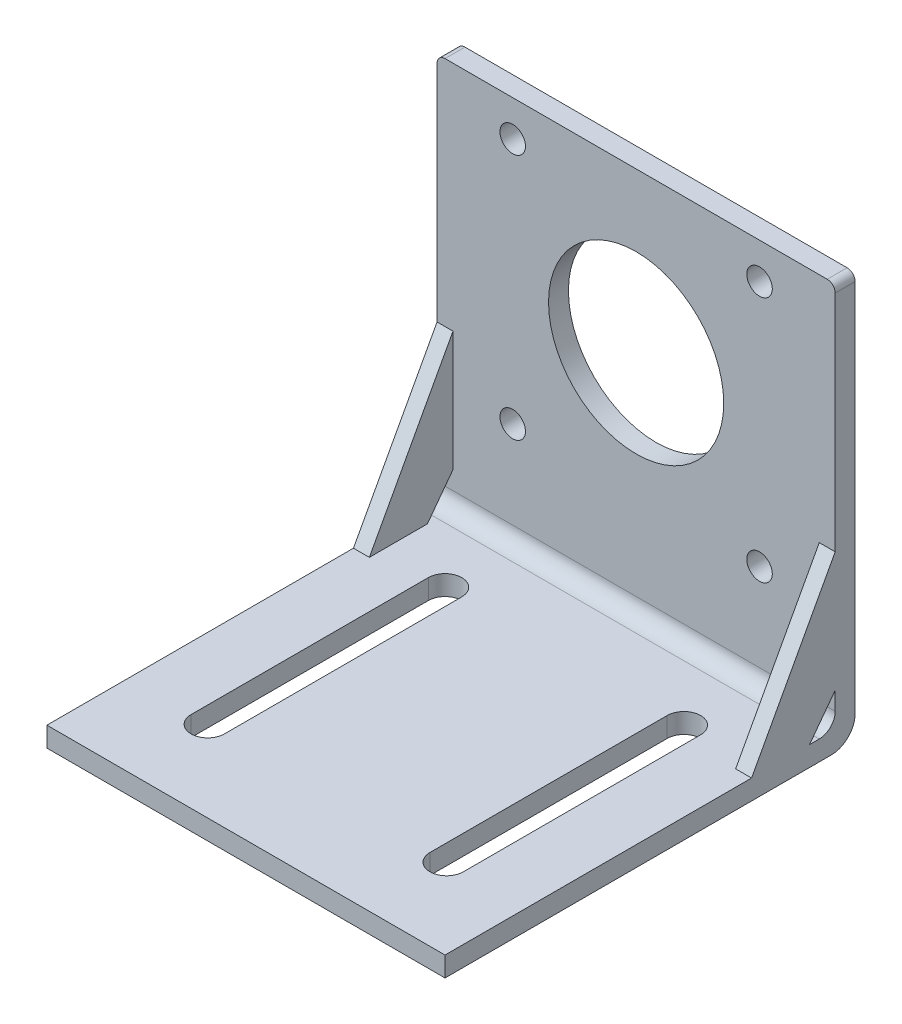
ISO-10303-21;
HEADER;
FILE_DESCRIPTION(('STEP AP214'),'2;1');
FILE_NAME('part.step','',(''),(''),'','','');
FILE_SCHEMA(('AUTOMOTIVE_DESIGN { 1 0 10303 214 1 1 1 1 }'));
ENDSEC;
DATA;
#1=APPLICATION_CONTEXT('core data for automotive mechanical design processes');
#2=APPLICATION_PROTOCOL_DEFINITION('international standard','automotive_design',2000,#1);
#3=PRODUCT_CONTEXT('',#1,'mechanical');
#4=PRODUCT('Part','Part','',(#3));
#5=PRODUCT_RELATED_PRODUCT_CATEGORY('part','',(#4));
#6=PRODUCT_DEFINITION_FORMATION('','',#4);
#7=PRODUCT_DEFINITION_CONTEXT('part definition',#1,'design');
#8=PRODUCT_DEFINITION('design','',#6,#7);
#9=PRODUCT_DEFINITION_SHAPE('','',#8);
#10=(LENGTH_UNIT() NAMED_UNIT(*) SI_UNIT(.MILLI.,.METRE.));
#11=(NAMED_UNIT(*) PLANE_ANGLE_UNIT() SI_UNIT($,.RADIAN.));
#12=(NAMED_UNIT(*) SI_UNIT($,.STERADIAN.) SOLID_ANGLE_UNIT());
#13=UNCERTAINTY_MEASURE_WITH_UNIT(LENGTH_MEASURE(1.E-05),#10,'distance_accuracy_value','');
#14=(GEOMETRIC_REPRESENTATION_CONTEXT(3) GLOBAL_UNCERTAINTY_ASSIGNED_CONTEXT((#13)) GLOBAL_UNIT_ASSIGNED_CONTEXT((#10,
#11,#12)) REPRESENTATION_CONTEXT('',''));
#15=CARTESIAN_POINT('',(0.,0.,0.));
#16=DIRECTION('',(0.,0.,1.));
#17=DIRECTION('',(1.,0.,0.));
#18=AXIS2_PLACEMENT_3D('',#15,#16,#17);
#19=CARTESIAN_POINT('',(12.5004011997071,49.1502196090274,2.5));
#20=DIRECTION('',(0.,0.,1.));
#21=DIRECTION('',(1.,0.,0.));
#22=AXIS2_PLACEMENT_3D('',#19,#20,#21);
#23=PLANE('',#22);
#24=CARTESIAN_POINT('',(21.0004011997071,45.6502196090274,2.5));
#25=DIRECTION('',(0.,0.,-1.));
#26=DIRECTION('',(-1.,0.,0.));
#27=AXIS2_PLACEMENT_3D('',#24,#25,#26);
#28=CIRCLE('',#27,1.60000000000001);
#29=CARTESIAN_POINT('',(19.4004011997071,45.6502196090274,2.5));
#30=VERTEX_POINT('',#29);
#31=EDGE_CURVE('E434',#30,#30,#28,.T.);
#32=ORIENTED_EDGE('',*,*,#31,.T.);
#33=EDGE_LOOP('',(#32));
#34=FACE_BOUND('',#33,.T.);
#35=CARTESIAN_POINT('',(52.0004011997071,14.6502196090274,2.5));
#36=DIRECTION('',(0.,0.,-1.));
#37=DIRECTION('',(-1.,0.,0.));
#38=AXIS2_PLACEMENT_3D('',#35,#36,#37);
#39=CIRCLE('',#38,1.6);
#40=CARTESIAN_POINT('',(50.4004011997071,14.6502196090274,2.5));
#41=VERTEX_POINT('',#40);
#42=EDGE_CURVE('E428',#41,#41,#39,.T.);
#43=ORIENTED_EDGE('',*,*,#42,.T.);
#44=EDGE_LOOP('',(#43));
#45=FACE_BOUND('',#44,.T.);
#46=CARTESIAN_POINT('',(52.0004442333903,45.6502196090274,2.5));
#47=DIRECTION('',(0.,0.,-1.));
#48=DIRECTION('',(-1.,0.,0.));
#49=AXIS2_PLACEMENT_3D('',#46,#47,#48);
#50=CIRCLE('',#49,1.6);
#51=CARTESIAN_POINT('',(50.4004442333903,45.6502196090274,2.5));
#52=VERTEX_POINT('',#51);
#53=EDGE_CURVE('E422',#52,#52,#50,.T.);
#54=ORIENTED_EDGE('',*,*,#53,.T.);
#55=EDGE_LOOP('',(#54));
#56=FACE_BOUND('',#55,.T.);
#57=CARTESIAN_POINT('',(21.0004011997071,14.6502196090274,2.5));
#58=DIRECTION('',(0.,0.,-1.));
#59=DIRECTION('',(-1.,0.,0.));
#60=AXIS2_PLACEMENT_3D('',#57,#58,#59);
#61=CIRCLE('',#60,1.60000000000001);
#62=CARTESIAN_POINT('',(19.4004011997071,14.6502196090274,2.5));
#63=VERTEX_POINT('',#62);
#64=EDGE_CURVE('E416',#63,#63,#61,.T.);
#65=ORIENTED_EDGE('',*,*,#64,.T.);
#66=EDGE_LOOP('',(#65));
#67=FACE_BOUND('',#66,.T.);
#68=CARTESIAN_POINT('',(36.5004011997071,30.1502196090274,2.5));
#69=DIRECTION('',(0.,0.,-1.));
#70=DIRECTION('',(-1.,0.,0.));
#71=AXIS2_PLACEMENT_3D('',#68,#69,#70);
#72=CIRCLE('',#71,11.);
#73=CARTESIAN_POINT('',(25.5004011997071,30.1502196090274,2.5));
#74=VERTEX_POINT('',#73);
#75=EDGE_CURVE('E409',#74,#74,#72,.T.);
#76=ORIENTED_EDGE('',*,*,#75,.T.);
#77=EDGE_LOOP('',(#76));
#78=FACE_BOUND('',#77,.T.);
#79=DIRECTION('',(0.,-1.,0.));
#80=VECTOR('',#79,1.);
#81=CARTESIAN_POINT('',(61.5004011997071,49.1502196090274,2.5));
#82=LINE('',#81,#80);
#83=CARTESIAN_POINT('',(61.5004011997071,5.95009980357009,2.5));
#84=VERTEX_POINT('',#83);
#85=CARTESIAN_POINT('',(61.5004011997071,3.65021960902744,2.5));
#86=VERTEX_POINT('',#85);
#87=EDGE_CURVE('E37',#84,#86,#82,.T.);
#88=ORIENTED_EDGE('',*,*,#87,.F.);
#89=DIRECTION('',(-1.,0.,0.));
#90=VECTOR('',#89,1.);
#91=CARTESIAN_POINT('',(12.5004011997071,5.95009980357008,2.5));
#92=LINE('',#91,#90);
#93=CARTESIAN_POINT('',(59.5004011997071,5.95009980357009,2.5));
#94=VERTEX_POINT('',#93);
#95=EDGE_CURVE('E225',#84,#94,#92,.T.);
#96=ORIENTED_EDGE('',*,*,#95,.T.);
#97=DIRECTION('',(0.,1.,0.));
#98=VECTOR('',#97,1.);
#99=CARTESIAN_POINT('',(59.5004011997071,49.1502196090274,2.5));
#100=LINE('',#99,#98);
#101=CARTESIAN_POINT('',(59.5004011997071,21.0039904897568,2.5));
#102=VERTEX_POINT('',#101);
#103=EDGE_CURVE('E224',#94,#102,#100,.T.);
#104=ORIENTED_EDGE('',*,*,#103,.T.);
#105=DIRECTION('',(1.,0.,0.));
#106=VECTOR('',#105,1.);
#107=CARTESIAN_POINT('',(12.5004011997071,21.0039904897568,2.5));
#108=LINE('',#107,#106);
#109=CARTESIAN_POINT('',(61.5004011997071,21.0039904897568,2.5));
#110=VERTEX_POINT('',#109);
#111=EDGE_CURVE('E210',#102,#110,#108,.T.);
#112=ORIENTED_EDGE('',*,*,#111,.T.);
#113=CARTESIAN_POINT('',(61.5004011997071,49.1502196090274,2.5));
#114=VERTEX_POINT('',#113);
#115=EDGE_CURVE('E221',#114,#110,#82,.T.);
#116=ORIENTED_EDGE('',*,*,#115,.F.);
#117=CARTESIAN_POINT('',(60.5004011997071,49.1502196090274,2.5));
#118=DIRECTION('',(0.,0.,-1.));
#119=DIRECTION('',(1.,0.,0.));
#120=AXIS2_PLACEMENT_3D('',#117,#118,#119);
#121=CIRCLE('',#120,1.);
#122=CARTESIAN_POINT('',(60.5004011997071,50.1502196090274,2.5));
#123=VERTEX_POINT('',#122);
#124=EDGE_CURVE('E234',#123,#114,#121,.T.);
#125=ORIENTED_EDGE('',*,*,#124,.F.);
#126=DIRECTION('',(1.,0.,0.));
#127=VECTOR('',#126,1.);
#128=CARTESIAN_POINT('',(12.5004011997071,50.1502196090274,2.5));
#129=LINE('',#128,#127);
#130=CARTESIAN_POINT('',(12.5004011997071,50.1502196090274,2.5));
#131=VERTEX_POINT('',#130);
#132=EDGE_CURVE('E441',#131,#123,#129,.T.);
#133=ORIENTED_EDGE('',*,*,#132,.F.);
#134=CARTESIAN_POINT('',(12.5004011997071,49.1502196090274,2.5));
#135=DIRECTION('',(0.,0.,-1.));
#136=DIRECTION('',(1.,0.,0.));
#137=AXIS2_PLACEMENT_3D('',#134,#135,#136);
#138=CIRCLE('',#137,1.);
#139=CARTESIAN_POINT('',(11.5004011997071,49.1502196090274,2.5));
#140=VERTEX_POINT('',#139);
#141=EDGE_CURVE('E439',#140,#131,#138,.T.);
#142=ORIENTED_EDGE('',*,*,#141,.F.);
#143=DIRECTION('',(0.,1.,0.));
#144=VECTOR('',#143,1.);
#145=CARTESIAN_POINT('',(11.5004011997071,-0.84978039097256,2.5));
#146=LINE('',#145,#144);
#147=CARTESIAN_POINT('',(11.5004011997071,21.0039904897568,2.5));
#148=VERTEX_POINT('',#147);
#149=EDGE_CURVE('E230',#148,#140,#146,.T.);
#150=ORIENTED_EDGE('',*,*,#149,.F.);
#151=DIRECTION('',(-1.,0.,0.));
#152=VECTOR('',#151,1.);
#153=CARTESIAN_POINT('',(12.5004011997071,21.0039904897568,2.5));
#154=LINE('',#153,#152);
#155=CARTESIAN_POINT('',(13.5004011997071,21.0039904897568,2.5));
#156=VERTEX_POINT('',#155);
#157=EDGE_CURVE('E333',#156,#148,#154,.T.);
#158=ORIENTED_EDGE('',*,*,#157,.F.);
#159=DIRECTION('',(0.,-1.,0.));
#160=VECTOR('',#159,1.);
#161=CARTESIAN_POINT('',(13.5004011997071,49.1502196090274,2.5));
#162=LINE('',#161,#160);
#163=CARTESIAN_POINT('',(13.5004011997071,5.95009980357009,2.5));
#164=VERTEX_POINT('',#163);
#165=EDGE_CURVE('E326',#156,#164,#162,.T.);
#166=ORIENTED_EDGE('',*,*,#165,.T.);
#167=DIRECTION('',(1.,0.,0.));
#168=VECTOR('',#167,1.);
#169=CARTESIAN_POINT('',(12.5004011997071,5.95009980357008,2.5));
#170=LINE('',#169,#168);
#171=CARTESIAN_POINT('',(11.5004011997071,5.95009980357009,2.5));
#172=VERTEX_POINT('',#171);
#173=EDGE_CURVE('E331',#172,#164,#170,.T.);
#174=ORIENTED_EDGE('',*,*,#173,.F.);
#175=CARTESIAN_POINT('',(11.5004011997071,3.65021960902744,2.5));
#176=VERTEX_POINT('',#175);
#177=EDGE_CURVE('E232',#176,#172,#146,.T.);
#178=ORIENTED_EDGE('',*,*,#177,.F.);
#179=DIRECTION('',(-1.,0.,0.));
#180=VECTOR('',#179,1.);
#181=CARTESIAN_POINT('',(12.5004011997071,3.65021960902744,2.5));
#182=LINE('',#181,#180);
#183=EDGE_CURVE('E279',#176,#86,#182,.F.);
#184=ORIENTED_EDGE('',*,*,#183,.T.);
#185=EDGE_LOOP('',(#88,#96,#104,#112,#116,#125,#133,#142,#150,#158,#166,#174,#178,#184));
#186=FACE_BOUND('',#185,.T.);
#187=ADVANCED_FACE('F33',(#34,#45,#56,#67,#78,#186),#23,.T.);
#188=CARTESIAN_POINT('',(11.5004011997071,1.65021960902744,51.5));
#189=DIRECTION('',(0.,-1.,0.));
#190=DIRECTION('',(1.,0.,0.));
#191=AXIS2_PLACEMENT_3D('',#188,#189,#190);
#192=PLANE('',#191);
#193=DIRECTION('',(0.,0.,1.));
#194=VECTOR('',#193,1.);
#195=CARTESIAN_POINT('',(19.4004011997071,1.65021960902744,11.5));
#196=LINE('',#195,#194);
#197=CARTESIAN_POINT('',(19.4004011997071,1.65021960902744,11.5));
#198=VERTEX_POINT('',#197);
#199=CARTESIAN_POINT('',(19.4004011997071,1.65021960902744,41.3));
#200=VERTEX_POINT('',#199);
#201=EDGE_CURVE('E384',#198,#200,#196,.T.);
#202=ORIENTED_EDGE('',*,*,#201,.F.);
#203=CARTESIAN_POINT('',(21.5004011997071,1.65021960902744,11.5));
#204=DIRECTION('',(0.,1.,0.));
#205=DIRECTION('',(-1.,0.,0.));
#206=AXIS2_PLACEMENT_3D('',#203,#204,#205);
#207=CIRCLE('',#206,2.1);
#208=CARTESIAN_POINT('',(23.6004011997071,1.65021960902744,11.5));
#209=VERTEX_POINT('',#208);
#210=EDGE_CURVE('E362',#209,#198,#207,.T.);
#211=ORIENTED_EDGE('',*,*,#210,.F.);
#212=DIRECTION('',(0.,0.,-1.));
#213=VECTOR('',#212,1.);
#214=CARTESIAN_POINT('',(23.6004011997071,1.65021960902744,11.5));
#215=LINE('',#214,#213);
#216=CARTESIAN_POINT('',(23.6004011997071,1.65021960902744,41.3));
#217=VERTEX_POINT('',#216);
#218=EDGE_CURVE('E373',#217,#209,#215,.T.);
#219=ORIENTED_EDGE('',*,*,#218,.F.);
#220=CARTESIAN_POINT('',(21.5004011997071,1.65021960902744,41.3));
#221=DIRECTION('',(0.,1.,0.));
#222=DIRECTION('',(-1.,0.,0.));
#223=AXIS2_PLACEMENT_3D('',#220,#221,#222);
#224=CIRCLE('',#223,2.1);
#225=EDGE_CURVE('E387',#200,#217,#224,.T.);
#226=ORIENTED_EDGE('',*,*,#225,.F.);
#227=EDGE_LOOP('',(#202,#211,#219,#226));
#228=FACE_BOUND('',#227,.T.);
#229=DIRECTION('',(0.,0.,1.));
#230=VECTOR('',#229,1.);
#231=CARTESIAN_POINT('',(49.4004011997071,1.65021960902744,11.5));
#232=LINE('',#231,#230);
#233=CARTESIAN_POINT('',(49.4004011997071,1.65021960902744,11.5));
#234=VERTEX_POINT('',#233);
#235=CARTESIAN_POINT('',(49.4004011997071,1.65021960902744,41.3));
#236=VERTEX_POINT('',#235);
#237=EDGE_CURVE('E352',#234,#236,#232,.T.);
#238=ORIENTED_EDGE('',*,*,#237,.F.);
#239=CARTESIAN_POINT('',(51.5004011997071,1.65021960902744,11.5));
#240=DIRECTION('',(0.,1.,0.));
#241=DIRECTION('',(1.,0.,0.));
#242=AXIS2_PLACEMENT_3D('',#239,#240,#241);
#243=CIRCLE('',#242,2.1);
#244=CARTESIAN_POINT('',(53.6004011997071,1.65021960902744,11.5));
#245=VERTEX_POINT('',#244);
#246=EDGE_CURVE('E336',#245,#234,#243,.T.);
#247=ORIENTED_EDGE('',*,*,#246,.F.);
#248=DIRECTION('',(0.,0.,-1.));
#249=VECTOR('',#248,1.);
#250=CARTESIAN_POINT('',(53.6004011997071,1.65021960902744,11.5));
#251=LINE('',#250,#249);
#252=CARTESIAN_POINT('',(53.6004011997071,1.65021960902744,41.3));
#253=VERTEX_POINT('',#252);
#254=EDGE_CURVE('E341',#253,#245,#251,.T.);
#255=ORIENTED_EDGE('',*,*,#254,.F.);
#256=CARTESIAN_POINT('',(51.5004011997071,1.65021960902744,41.3));
#257=DIRECTION('',(0.,1.,0.));
#258=DIRECTION('',(1.,0.,0.));
#259=AXIS2_PLACEMENT_3D('',#256,#257,#258);
#260=CIRCLE('',#259,2.1);
#261=EDGE_CURVE('E355',#236,#253,#260,.T.);
#262=ORIENTED_EDGE('',*,*,#261,.F.);
#263=EDGE_LOOP('',(#238,#247,#255,#262));
#264=FACE_BOUND('',#263,.T.);
#265=DIRECTION('',(-1.,0.,0.));
#266=VECTOR('',#265,1.);
#267=CARTESIAN_POINT('',(11.5004011997071,1.65021960902744,5.71255416833646));
#268=LINE('',#267,#266);
#269=CARTESIAN_POINT('',(61.5004011997071,1.65021960902744,5.71255416833646));
#270=VERTEX_POINT('',#269);
#271=CARTESIAN_POINT('',(59.5004011997071,1.65021960902744,5.71255416833646));
#272=VERTEX_POINT('',#271);
#273=EDGE_CURVE('E11',#270,#272,#268,.T.);
#274=ORIENTED_EDGE('',*,*,#273,.F.);
#275=DIRECTION('',(0.,0.,-1.));
#276=VECTOR('',#275,1.);
#277=CARTESIAN_POINT('',(61.5004011997071,1.65021960902744,51.5));
#278=LINE('',#277,#276);
#279=CARTESIAN_POINT('',(61.5004011997071,1.65021960902744,4.5));
#280=VERTEX_POINT('',#279);
#281=EDGE_CURVE('E258',#270,#280,#278,.T.);
#282=ORIENTED_EDGE('',*,*,#281,.T.);
#283=DIRECTION('',(-1.,0.,0.));
#284=VECTOR('',#283,1.);
#285=CARTESIAN_POINT('',(11.5004011997071,1.65021960902744,4.5));
#286=LINE('',#285,#284);
#287=CARTESIAN_POINT('',(11.5004011997071,1.65021960902744,4.5));
#288=VERTEX_POINT('',#287);
#289=EDGE_CURVE('E277',#280,#288,#286,.T.);
#290=ORIENTED_EDGE('',*,*,#289,.T.);
#291=DIRECTION('',(0.,0.,-1.));
#292=VECTOR('',#291,1.);
#293=CARTESIAN_POINT('',(11.5004011997071,1.65021960902744,51.5));
#294=LINE('',#293,#292);
#295=CARTESIAN_POINT('',(11.5004011997071,1.65021960902744,5.71255416833646));
#296=VERTEX_POINT('',#295);
#297=EDGE_CURVE('E293',#296,#288,#294,.T.);
#298=ORIENTED_EDGE('',*,*,#297,.F.);
#299=DIRECTION('',(1.,0.,0.));
#300=VECTOR('',#299,1.);
#301=CARTESIAN_POINT('',(11.5004011997071,1.65021960902744,5.71255416833646));
#302=LINE('',#301,#300);
#303=CARTESIAN_POINT('',(13.5004011997071,1.65021960902744,5.71255416833646));
#304=VERTEX_POINT('',#303);
#305=EDGE_CURVE('E298',#296,#304,#302,.T.);
#306=ORIENTED_EDGE('',*,*,#305,.T.);
#307=DIRECTION('',(0.,0.,-1.));
#308=VECTOR('',#307,1.);
#309=CARTESIAN_POINT('',(13.5004011997071,1.65021960902744,51.5));
#310=LINE('',#309,#308);
#311=CARTESIAN_POINT('',(13.5004011997071,1.65021960902744,13.0029610267373));
#312=VERTEX_POINT('',#311);
#313=EDGE_CURVE('E292',#312,#304,#310,.T.);
#314=ORIENTED_EDGE('',*,*,#313,.F.);
#315=DIRECTION('',(-1.,0.,0.));
#316=VECTOR('',#315,1.);
#317=CARTESIAN_POINT('',(11.5004011997071,1.65021960902744,13.0029610267373));
#318=LINE('',#317,#316);
#319=CARTESIAN_POINT('',(11.5004011997071,1.65021960902744,13.0029610267373));
#320=VERTEX_POINT('',#319);
#321=EDGE_CURVE('E256',#312,#320,#318,.T.);
#322=ORIENTED_EDGE('',*,*,#321,.T.);
#323=CARTESIAN_POINT('',(11.5004011997071,1.65021960902744,51.5));
#324=VERTEX_POINT('',#323);
#325=EDGE_CURVE('E239',#324,#320,#294,.T.);
#326=ORIENTED_EDGE('',*,*,#325,.F.);
#327=DIRECTION('',(-1.,0.,0.));
#328=VECTOR('',#327,1.);
#329=CARTESIAN_POINT('',(11.5004011997071,1.65021960902744,51.5));
#330=LINE('',#329,#328);
#331=CARTESIAN_POINT('',(61.5004011997071,1.65021960902744,51.5));
#332=VERTEX_POINT('',#331);
#333=EDGE_CURVE('E295',#332,#324,#330,.T.);
#334=ORIENTED_EDGE('',*,*,#333,.F.);
#335=CARTESIAN_POINT('',(61.5004011997071,1.65021960902744,13.0029610267373));
#336=VERTEX_POINT('',#335);
#337=EDGE_CURVE('E261',#332,#336,#278,.T.);
#338=ORIENTED_EDGE('',*,*,#337,.T.);
#339=DIRECTION('',(1.,0.,0.));
#340=VECTOR('',#339,1.);
#341=CARTESIAN_POINT('',(11.5004011997071,1.65021960902744,13.0029610267373));
#342=LINE('',#341,#340);
#343=CARTESIAN_POINT('',(59.5004011997071,1.65021960902744,13.0029610267373));
#344=VERTEX_POINT('',#343);
#345=EDGE_CURVE('E43',#344,#336,#342,.T.);
#346=ORIENTED_EDGE('',*,*,#345,.F.);
#347=DIRECTION('',(0.,0.,1.));
#348=VECTOR('',#347,1.);
#349=CARTESIAN_POINT('',(59.5004011997071,1.65021960902744,51.5));
#350=LINE('',#349,#348);
#351=EDGE_CURVE('E262',#272,#344,#350,.T.);
#352=ORIENTED_EDGE('',*,*,#351,.F.);
#353=EDGE_LOOP('',(#274,#282,#290,#298,#306,#314,#322,#326,#334,#338,#346,#352));
#354=FACE_BOUND('',#353,.T.);
#355=ADVANCED_FACE('F479',(#228,#264,#354),#192,.F.);
#356=CARTESIAN_POINT('',(12.5004011997071,49.1502196090274,2.5));
#357=DIRECTION('',(0.,0.,-1.));
#358=DIRECTION('',(-1.,0.,0.));
#359=AXIS2_PLACEMENT_3D('',#356,#357,#358);
#360=CYLINDRICAL_SURFACE('',#359,1.);
#361=CARTESIAN_POINT('',(12.5004011997071,49.1502196090274,0.));
#362=DIRECTION('',(0.,0.,-1.));
#363=DIRECTION('',(1.,0.,0.));
#364=AXIS2_PLACEMENT_3D('',#361,#362,#363);
#365=CIRCLE('',#364,1.);
#366=CARTESIAN_POINT('',(11.5004011997071,49.1502196090274,0.));
#367=VERTEX_POINT('',#366);
#368=CARTESIAN_POINT('',(12.5004011997071,50.1502196090274,0.));
#369=VERTEX_POINT('',#368);
#370=EDGE_CURVE('E248',#367,#369,#365,.T.);
#371=ORIENTED_EDGE('',*,*,#370,.F.);
#372=DIRECTION('',(0.,0.,-1.));
#373=VECTOR('',#372,1.);
#374=CARTESIAN_POINT('',(11.5004011997071,49.1502196090274,2.5));
#375=LINE('',#374,#373);
#376=EDGE_CURVE('E272',#140,#367,#375,.T.);
#377=ORIENTED_EDGE('',*,*,#376,.F.);
#378=ORIENTED_EDGE('',*,*,#141,.T.);
#379=DIRECTION('',(0.,0.,-1.));
#380=VECTOR('',#379,1.);
#381=CARTESIAN_POINT('',(12.5004011997071,50.1502196090274,2.5));
#382=LINE('',#381,#380);
#383=EDGE_CURVE('E237',#131,#369,#382,.T.);
#384=ORIENTED_EDGE('',*,*,#383,.T.);
#385=EDGE_LOOP('',(#371,#377,#378,#384));
#386=FACE_BOUND('',#385,.T.);
#387=ADVANCED_FACE('F455',(#386),#360,.T.);
#388=CARTESIAN_POINT('',(11.5004011997071,-0.84978039097256,2.5));
#389=DIRECTION('',(-1.,0.,0.));
#390=DIRECTION('',(0.,0.,1.));
#391=AXIS2_PLACEMENT_3D('',#388,#389,#390);
#392=PLANE('',#391);
#393=ORIENTED_EDGE('',*,*,#325,.T.);
#394=DIRECTION('',(0.,0.87891762662254,-0.476973590057354));
#395=VECTOR('',#394,1.);
#396=CARTESIAN_POINT('',(11.5004011997071,21.9498447287149,1.98670105324832));
#397=LINE('',#396,#395);
#398=EDGE_CURVE('E323',#320,#148,#397,.T.);
#399=ORIENTED_EDGE('',*,*,#398,.T.);
#400=ORIENTED_EDGE('',*,*,#149,.T.);
#401=ORIENTED_EDGE('',*,*,#376,.T.);
#402=DIRECTION('',(0.,1.,0.));
#403=VECTOR('',#402,1.);
#404=CARTESIAN_POINT('',(11.5004011997071,-0.84978039097256,0.));
#405=LINE('',#404,#403);
#406=CARTESIAN_POINT('',(11.5004011997071,2.15021960902744,0.));
#407=VERTEX_POINT('',#406);
#408=EDGE_CURVE('E442',#407,#367,#405,.T.);
#409=ORIENTED_EDGE('',*,*,#408,.F.);
#410=CARTESIAN_POINT('',(11.5004011997071,2.15021960902744,3.));
#411=DIRECTION('',(-1.,0.,0.));
#412=DIRECTION('',(0.,0.,1.));
#413=AXIS2_PLACEMENT_3D('',#410,#411,#412);
#414=CIRCLE('',#413,3.);
#415=CARTESIAN_POINT('',(11.5004011997071,-0.84978039097256,3.));
#416=VERTEX_POINT('',#415);
#417=EDGE_CURVE('E271',#407,#416,#414,.T.);
#418=ORIENTED_EDGE('',*,*,#417,.T.);
#419=DIRECTION('',(0.,0.,-1.));
#420=VECTOR('',#419,1.);
#421=CARTESIAN_POINT('',(11.5004011997071,-0.84978039097256,2.5));
#422=LINE('',#421,#420);
#423=CARTESIAN_POINT('',(11.5004011997071,-0.84978039097256,51.5));
#424=VERTEX_POINT('',#423);
#425=EDGE_CURVE('E461',#424,#416,#422,.T.);
#426=ORIENTED_EDGE('',*,*,#425,.F.);
#427=DIRECTION('',(0.,-1.,0.));
#428=VECTOR('',#427,1.);
#429=CARTESIAN_POINT('',(11.5004011997071,-0.84978039097256,51.5));
#430=LINE('',#429,#428);
#431=EDGE_CURVE('E394',#324,#424,#430,.T.);
#432=ORIENTED_EDGE('',*,*,#431,.F.);
#433=EDGE_LOOP('',(#393,#399,#400,#401,#409,#418,#426,#432));
#434=FACE_BOUND('',#433,.T.);
#435=ORIENTED_EDGE('',*,*,#177,.T.);
#436=DIRECTION('',(0.,-0.80110361387874,0.598525688530094));
#437=VECTOR('',#436,1.);
#438=CARTESIAN_POINT('',(11.5004011997071,6.63713070153002,1.98670105324832));
#439=LINE('',#438,#437);
#440=EDGE_CURVE('E318',#172,#296,#439,.T.);
#441=ORIENTED_EDGE('',*,*,#440,.T.);
#442=ORIENTED_EDGE('',*,*,#297,.T.);
#443=CARTESIAN_POINT('',(11.5004011997071,3.65021960902744,4.5));
#444=DIRECTION('',(-1.,0.,0.));
#445=DIRECTION('',(0.,0.,1.));
#446=AXIS2_PLACEMENT_3D('',#443,#444,#445);
#447=CIRCLE('',#446,2.);
#448=EDGE_CURVE('E283',#288,#176,#447,.F.);
#449=ORIENTED_EDGE('',*,*,#448,.T.);
#450=EDGE_LOOP('',(#435,#441,#442,#449));
#451=FACE_BOUND('',#450,.T.);
#452=ADVANCED_FACE('F473',(#434,#451),#392,.T.);
#453=CARTESIAN_POINT('',(61.5004011997071,-0.849780390972568,2.5));
#454=DIRECTION('',(0.,-1.,0.));
#455=DIRECTION('',(1.,0.,0.));
#456=AXIS2_PLACEMENT_3D('',#453,#454,#455);
#457=PLANE('',#456);
#458=CARTESIAN_POINT('',(51.5004011997071,-0.849780390972568,11.5));
#459=DIRECTION('',(0.,1.,0.));
#460=DIRECTION('',(1.,0.,0.));
#461=AXIS2_PLACEMENT_3D('',#458,#459,#460);
#462=CIRCLE('',#461,2.1);
#463=CARTESIAN_POINT('',(53.6004011997071,-0.849780390972568,11.5));
#464=VERTEX_POINT('',#463);
#465=CARTESIAN_POINT('',(49.4004011997071,-0.849780390972568,11.5));
#466=VERTEX_POINT('',#465);
#467=EDGE_CURVE('E337',#464,#466,#462,.T.);
#468=ORIENTED_EDGE('',*,*,#467,.T.);
#469=DIRECTION('',(0.,0.,1.));
#470=VECTOR('',#469,1.);
#471=CARTESIAN_POINT('',(49.4004011997071,-0.849780390972568,11.5));
#472=LINE('',#471,#470);
#473=CARTESIAN_POINT('',(49.4004011997071,-0.849780390972566,41.3));
#474=VERTEX_POINT('',#473);
#475=EDGE_CURVE('E340',#466,#474,#472,.T.);
#476=ORIENTED_EDGE('',*,*,#475,.T.);
#477=CARTESIAN_POINT('',(51.5004011997071,-0.849780390972568,41.3));
#478=DIRECTION('',(0.,1.,0.));
#479=DIRECTION('',(1.,0.,0.));
#480=AXIS2_PLACEMENT_3D('',#477,#478,#479);
#481=CIRCLE('',#480,2.1);
#482=CARTESIAN_POINT('',(53.6004011997071,-0.849780390972568,41.3));
#483=VERTEX_POINT('',#482);
#484=EDGE_CURVE('E344',#474,#483,#481,.T.);
#485=ORIENTED_EDGE('',*,*,#484,.T.);
#486=DIRECTION('',(0.,0.,-1.));
#487=VECTOR('',#486,1.);
#488=CARTESIAN_POINT('',(53.6004011997071,-0.849780390972568,11.5));
#489=LINE('',#488,#487);
#490=EDGE_CURVE('E347',#483,#464,#489,.T.);
#491=ORIENTED_EDGE('',*,*,#490,.T.);
#492=EDGE_LOOP('',(#468,#476,#485,#491));
#493=FACE_BOUND('',#492,.T.);
#494=CARTESIAN_POINT('',(21.5004011997071,-0.849780390972569,11.5));
#495=DIRECTION('',(0.,1.,0.));
#496=DIRECTION('',(-1.,0.,0.));
#497=AXIS2_PLACEMENT_3D('',#494,#495,#496);
#498=CIRCLE('',#497,2.1);
#499=CARTESIAN_POINT('',(23.6004011997071,-0.849780390972569,11.5));
#500=VERTEX_POINT('',#499);
#501=CARTESIAN_POINT('',(19.4004011997071,-0.849780390972569,11.5));
#502=VERTEX_POINT('',#501);
#503=EDGE_CURVE('E369',#500,#502,#498,.T.);
#504=ORIENTED_EDGE('',*,*,#503,.T.);
#505=DIRECTION('',(0.,0.,1.));
#506=VECTOR('',#505,1.);
#507=CARTESIAN_POINT('',(19.4004011997071,-0.849780390972569,11.5));
#508=LINE('',#507,#506);
#509=CARTESIAN_POINT('',(19.4004011997071,-0.849780390972562,41.3));
#510=VERTEX_POINT('',#509);
#511=EDGE_CURVE('E372',#502,#510,#508,.T.);
#512=ORIENTED_EDGE('',*,*,#511,.T.);
#513=CARTESIAN_POINT('',(21.5004011997071,-0.849780390972569,41.3));
#514=DIRECTION('',(0.,1.,0.));
#515=DIRECTION('',(-1.,0.,0.));
#516=AXIS2_PLACEMENT_3D('',#513,#514,#515);
#517=CIRCLE('',#516,2.1);
#518=CARTESIAN_POINT('',(23.6004011997071,-0.849780390972569,41.3));
#519=VERTEX_POINT('',#518);
#520=EDGE_CURVE('E376',#510,#519,#517,.T.);
#521=ORIENTED_EDGE('',*,*,#520,.T.);
#522=DIRECTION('',(0.,0.,-1.));
#523=VECTOR('',#522,1.);
#524=CARTESIAN_POINT('',(23.6004011997071,-0.849780390972569,11.5));
#525=LINE('',#524,#523);
#526=EDGE_CURVE('E379',#519,#500,#525,.T.);
#527=ORIENTED_EDGE('',*,*,#526,.T.);
#528=EDGE_LOOP('',(#504,#512,#521,#527));
#529=FACE_BOUND('',#528,.T.);
#530=ORIENTED_EDGE('',*,*,#425,.T.);
#531=DIRECTION('',(-1.,0.,0.));
#532=VECTOR('',#531,1.);
#533=CARTESIAN_POINT('',(61.5004011997071,-0.849780390972568,3.));
#534=LINE('',#533,#532);
#535=CARTESIAN_POINT('',(61.5004011997071,-0.849780390972568,3.));
#536=VERTEX_POINT('',#535);
#537=EDGE_CURVE('E274',#416,#536,#534,.F.);
#538=ORIENTED_EDGE('',*,*,#537,.T.);
#539=DIRECTION('',(0.,0.,-1.));
#540=VECTOR('',#539,1.);
#541=CARTESIAN_POINT('',(61.5004011997071,-0.849780390972568,2.5));
#542=LINE('',#541,#540);
#543=CARTESIAN_POINT('',(61.5004011997071,-0.84978039097256,51.5));
#544=VERTEX_POINT('',#543);
#545=EDGE_CURVE('E464',#544,#536,#542,.T.);
#546=ORIENTED_EDGE('',*,*,#545,.F.);
#547=DIRECTION('',(1.,0.,0.));
#548=VECTOR('',#547,1.);
#549=CARTESIAN_POINT('',(11.5004011997071,-0.84978039097256,51.5));
#550=LINE('',#549,#548);
#551=EDGE_CURVE('E403',#424,#544,#550,.T.);
#552=ORIENTED_EDGE('',*,*,#551,.F.);
#553=EDGE_LOOP('',(#530,#538,#546,#552));
#554=FACE_BOUND('',#553,.T.);
#555=ADVANCED_FACE('F523',(#493,#529,#554),#457,.T.);
#556=CARTESIAN_POINT('',(61.5004011997071,49.1502196090274,2.5));
#557=DIRECTION('',(1.,0.,0.));
#558=DIRECTION('',(0.,0.,-1.));
#559=AXIS2_PLACEMENT_3D('',#556,#557,#558);
#560=PLANE('',#559);
#561=DIRECTION('',(0.,-0.80110361387874,0.598525688530094));
#562=VECTOR('',#561,1.);
#563=CARTESIAN_POINT('',(61.5004011997071,6.63713070153002,1.98670105324832));
#564=LINE('',#563,#562);
#565=EDGE_CURVE('E50',#84,#270,#564,.T.);
#566=ORIENTED_EDGE('',*,*,#565,.F.);
#567=ORIENTED_EDGE('',*,*,#87,.T.);
#568=CARTESIAN_POINT('',(61.5004011997071,3.65021960902744,4.5));
#569=DIRECTION('',(1.,0.,0.));
#570=DIRECTION('',(0.,0.,-1.));
#571=AXIS2_PLACEMENT_3D('',#568,#569,#570);
#572=CIRCLE('',#571,2.);
#573=EDGE_CURVE('E287',#86,#280,#572,.F.);
#574=ORIENTED_EDGE('',*,*,#573,.T.);
#575=ORIENTED_EDGE('',*,*,#281,.F.);
#576=EDGE_LOOP('',(#566,#567,#574,#575));
#577=FACE_BOUND('',#576,.T.);
#578=DIRECTION('',(0.,0.87891762662254,-0.476973590057354));
#579=VECTOR('',#578,1.);
#580=CARTESIAN_POINT('',(61.5004011997071,21.9498447287149,1.98670105324832));
#581=LINE('',#580,#579);
#582=EDGE_CURVE('E206',#336,#110,#581,.T.);
#583=ORIENTED_EDGE('',*,*,#582,.F.);
#584=ORIENTED_EDGE('',*,*,#337,.F.);
#585=DIRECTION('',(0.,1.,0.));
#586=VECTOR('',#585,1.);
#587=CARTESIAN_POINT('',(61.5004011997071,-0.84978039097256,51.5));
#588=LINE('',#587,#586);
#589=EDGE_CURVE('E406',#544,#332,#588,.T.);
#590=ORIENTED_EDGE('',*,*,#589,.F.);
#591=ORIENTED_EDGE('',*,*,#545,.T.);
#592=CARTESIAN_POINT('',(61.5004011997071,2.15021960902743,3.));
#593=DIRECTION('',(1.,0.,0.));
#594=DIRECTION('',(0.,0.,-1.));
#595=AXIS2_PLACEMENT_3D('',#592,#593,#594);
#596=CIRCLE('',#595,3.);
#597=CARTESIAN_POINT('',(61.5004011997071,2.15021960902743,0.));
#598=VERTEX_POINT('',#597);
#599=EDGE_CURVE('E276',#536,#598,#596,.T.);
#600=ORIENTED_EDGE('',*,*,#599,.T.);
#601=DIRECTION('',(0.,-1.,0.));
#602=VECTOR('',#601,1.);
#603=CARTESIAN_POINT('',(61.5004011997071,49.1502196090274,0.));
#604=LINE('',#603,#602);
#605=CARTESIAN_POINT('',(61.5004011997071,49.1502196090274,0.));
#606=VERTEX_POINT('',#605);
#607=EDGE_CURVE('E548',#606,#598,#604,.T.);
#608=ORIENTED_EDGE('',*,*,#607,.F.);
#609=DIRECTION('',(0.,0.,-1.));
#610=VECTOR('',#609,1.);
#611=CARTESIAN_POINT('',(61.5004011997071,49.1502196090274,2.5));
#612=LINE('',#611,#610);
#613=EDGE_CURVE('E229',#114,#606,#612,.T.);
#614=ORIENTED_EDGE('',*,*,#613,.F.);
#615=ORIENTED_EDGE('',*,*,#115,.T.);
#616=EDGE_LOOP('',(#583,#584,#590,#591,#600,#608,#614,#615));
#617=FACE_BOUND('',#616,.T.);
#618=ADVANCED_FACE('F227',(#577,#617),#560,.T.);
#619=CARTESIAN_POINT('',(60.5004011997071,49.1502196090274,2.5));
#620=DIRECTION('',(0.,0.,-1.));
#621=DIRECTION('',(-1.,0.,0.));
#622=AXIS2_PLACEMENT_3D('',#619,#620,#621);
#623=CYLINDRICAL_SURFACE('',#622,1.);
#624=CARTESIAN_POINT('',(60.5004011997071,49.1502196090274,0.));
#625=DIRECTION('',(0.,0.,-1.));
#626=DIRECTION('',(1.,0.,0.));
#627=AXIS2_PLACEMENT_3D('',#624,#625,#626);
#628=CIRCLE('',#627,1.);
#629=CARTESIAN_POINT('',(60.5004011997071,50.1502196090274,0.));
#630=VERTEX_POINT('',#629);
#631=EDGE_CURVE('E553',#630,#606,#628,.T.);
#632=ORIENTED_EDGE('',*,*,#631,.F.);
#633=DIRECTION('',(0.,0.,-1.));
#634=VECTOR('',#633,1.);
#635=CARTESIAN_POINT('',(60.5004011997071,50.1502196090274,2.5));
#636=LINE('',#635,#634);
#637=EDGE_CURVE('E449',#123,#630,#636,.T.);
#638=ORIENTED_EDGE('',*,*,#637,.F.);
#639=ORIENTED_EDGE('',*,*,#124,.T.);
#640=ORIENTED_EDGE('',*,*,#613,.T.);
#641=EDGE_LOOP('',(#632,#638,#639,#640));
#642=FACE_BOUND('',#641,.T.);
#643=ADVANCED_FACE('F448',(#642),#623,.T.);
#644=CARTESIAN_POINT('',(12.5004011997071,50.1502196090274,2.5));
#645=DIRECTION('',(0.,1.,0.));
#646=DIRECTION('',(0.,0.,1.));
#647=AXIS2_PLACEMENT_3D('',#644,#645,#646);
#648=PLANE('',#647);
#649=DIRECTION('',(1.,0.,0.));
#650=VECTOR('',#649,1.);
#651=CARTESIAN_POINT('',(12.5004011997071,50.1502196090274,0.));
#652=LINE('',#651,#650);
#653=EDGE_CURVE('E554',#369,#630,#652,.T.);
#654=ORIENTED_EDGE('',*,*,#653,.F.);
#655=ORIENTED_EDGE('',*,*,#383,.F.);
#656=ORIENTED_EDGE('',*,*,#132,.T.);
#657=ORIENTED_EDGE('',*,*,#637,.T.);
#658=EDGE_LOOP('',(#654,#655,#656,#657));
#659=FACE_BOUND('',#658,.T.);
#660=ADVANCED_FACE('F519',(#659),#648,.T.);
#661=CARTESIAN_POINT('',(12.5004011997071,49.1502196090274,0.));
#662=DIRECTION('',(0.,0.,1.));
#663=DIRECTION('',(1.,0.,0.));
#664=AXIS2_PLACEMENT_3D('',#661,#662,#663);
#665=PLANE('',#664);
#666=CARTESIAN_POINT('',(36.5004011997071,30.1502196090274,0.));
#667=DIRECTION('',(0.,0.,-1.));
#668=DIRECTION('',(-1.,0.,0.));
#669=AXIS2_PLACEMENT_3D('',#666,#667,#668);
#670=CIRCLE('',#669,11.);
#671=CARTESIAN_POINT('',(25.5004011997071,30.1502196090274,0.));
#672=VERTEX_POINT('',#671);
#673=EDGE_CURVE('E413',#672,#672,#670,.T.);
#674=ORIENTED_EDGE('',*,*,#673,.F.);
#675=EDGE_LOOP('',(#674));
#676=FACE_BOUND('',#675,.T.);
#677=CARTESIAN_POINT('',(21.0004011997071,14.6502196090274,0.));
#678=DIRECTION('',(0.,0.,-1.));
#679=DIRECTION('',(-1.,0.,0.));
#680=AXIS2_PLACEMENT_3D('',#677,#678,#679);
#681=CIRCLE('',#680,1.60000000000001);
#682=CARTESIAN_POINT('',(19.4004011997071,14.6502196090274,0.));
#683=VERTEX_POINT('',#682);
#684=EDGE_CURVE('E412',#683,#683,#681,.T.);
#685=ORIENTED_EDGE('',*,*,#684,.F.);
#686=EDGE_LOOP('',(#685));
#687=FACE_BOUND('',#686,.T.);
#688=CARTESIAN_POINT('',(52.0004442333903,45.6502196090274,0.));
#689=DIRECTION('',(0.,0.,-1.));
#690=DIRECTION('',(-1.,0.,0.));
#691=AXIS2_PLACEMENT_3D('',#688,#689,#690);
#692=CIRCLE('',#691,1.6);
#693=CARTESIAN_POINT('',(50.4004442333903,45.6502196090274,0.));
#694=VERTEX_POINT('',#693);
#695=EDGE_CURVE('E419',#694,#694,#692,.T.);
#696=ORIENTED_EDGE('',*,*,#695,.F.);
#697=EDGE_LOOP('',(#696));
#698=FACE_BOUND('',#697,.T.);
#699=CARTESIAN_POINT('',(52.0004011997071,14.6502196090274,0.));
#700=DIRECTION('',(0.,0.,-1.));
#701=DIRECTION('',(-1.,0.,0.));
#702=AXIS2_PLACEMENT_3D('',#699,#700,#701);
#703=CIRCLE('',#702,1.6);
#704=CARTESIAN_POINT('',(50.4004011997071,14.6502196090274,0.));
#705=VERTEX_POINT('',#704);
#706=EDGE_CURVE('E425',#705,#705,#703,.T.);
#707=ORIENTED_EDGE('',*,*,#706,.F.);
#708=EDGE_LOOP('',(#707));
#709=FACE_BOUND('',#708,.T.);
#710=CARTESIAN_POINT('',(21.0004011997071,45.6502196090274,0.));
#711=DIRECTION('',(0.,0.,-1.));
#712=DIRECTION('',(-1.,0.,0.));
#713=AXIS2_PLACEMENT_3D('',#710,#711,#712);
#714=CIRCLE('',#713,1.60000000000001);
#715=CARTESIAN_POINT('',(19.4004011997071,45.6502196090274,0.));
#716=VERTEX_POINT('',#715);
#717=EDGE_CURVE('E431',#716,#716,#714,.T.);
#718=ORIENTED_EDGE('',*,*,#717,.F.);
#719=EDGE_LOOP('',(#718));
#720=FACE_BOUND('',#719,.T.);
#721=ORIENTED_EDGE('',*,*,#607,.T.);
#722=DIRECTION('',(-1.,0.,0.));
#723=VECTOR('',#722,1.);
#724=CARTESIAN_POINT('',(11.5004011997071,2.15021960902744,0.));
#725=LINE('',#724,#723);
#726=EDGE_CURVE('E267',#598,#407,#725,.T.);
#727=ORIENTED_EDGE('',*,*,#726,.T.);
#728=ORIENTED_EDGE('',*,*,#408,.T.);
#729=ORIENTED_EDGE('',*,*,#370,.T.);
#730=ORIENTED_EDGE('',*,*,#653,.T.);
#731=ORIENTED_EDGE('',*,*,#631,.T.);
#732=EDGE_LOOP('',(#721,#727,#728,#729,#730,#731));
#733=FACE_BOUND('',#732,.T.);
#734=ADVANCED_FACE('F514',(#676,#687,#698,#709,#720,#733),#665,.F.);
#735=CARTESIAN_POINT('',(21.0004011997071,45.6502196090274,2.5));
#736=DIRECTION('',(0.,0.,-1.));
#737=DIRECTION('',(-1.,0.,0.));
#738=AXIS2_PLACEMENT_3D('',#735,#736,#737);
#739=CYLINDRICAL_SURFACE('',#738,1.60000000000001);
#740=ORIENTED_EDGE('',*,*,#31,.F.);
#741=EDGE_LOOP('',(#740));
#742=FACE_BOUND('',#741,.T.);
#743=ORIENTED_EDGE('',*,*,#717,.T.);
#744=EDGE_LOOP('',(#743));
#745=FACE_BOUND('',#744,.T.);
#746=ADVANCED_FACE('F511',(#742,#745),#739,.F.);
#747=CARTESIAN_POINT('',(52.0004011997071,14.6502196090274,2.5));
#748=DIRECTION('',(0.,0.,-1.));
#749=DIRECTION('',(-1.,0.,0.));
#750=AXIS2_PLACEMENT_3D('',#747,#748,#749);
#751=CYLINDRICAL_SURFACE('',#750,1.6);
#752=ORIENTED_EDGE('',*,*,#42,.F.);
#753=EDGE_LOOP('',(#752));
#754=FACE_BOUND('',#753,.T.);
#755=ORIENTED_EDGE('',*,*,#706,.T.);
#756=EDGE_LOOP('',(#755));
#757=FACE_BOUND('',#756,.T.);
#758=ADVANCED_FACE('F507',(#754,#757),#751,.F.);
#759=CARTESIAN_POINT('',(52.0004442333903,45.6502196090274,2.5));
#760=DIRECTION('',(0.,0.,-1.));
#761=DIRECTION('',(-1.,0.,0.));
#762=AXIS2_PLACEMENT_3D('',#759,#760,#761);
#763=CYLINDRICAL_SURFACE('',#762,1.6);
#764=ORIENTED_EDGE('',*,*,#53,.F.);
#765=EDGE_LOOP('',(#764));
#766=FACE_BOUND('',#765,.T.);
#767=ORIENTED_EDGE('',*,*,#695,.T.);
#768=EDGE_LOOP('',(#767));
#769=FACE_BOUND('',#768,.T.);
#770=ADVANCED_FACE('F503',(#766,#769),#763,.F.);
#771=CARTESIAN_POINT('',(21.0004011997071,14.6502196090274,2.5));
#772=DIRECTION('',(0.,0.,-1.));
#773=DIRECTION('',(-1.,0.,0.));
#774=AXIS2_PLACEMENT_3D('',#771,#772,#773);
#775=CYLINDRICAL_SURFACE('',#774,1.60000000000001);
#776=ORIENTED_EDGE('',*,*,#64,.F.);
#777=EDGE_LOOP('',(#776));
#778=FACE_BOUND('',#777,.T.);
#779=ORIENTED_EDGE('',*,*,#684,.T.);
#780=EDGE_LOOP('',(#779));
#781=FACE_BOUND('',#780,.T.);
#782=ADVANCED_FACE('F499',(#778,#781),#775,.F.);
#783=CARTESIAN_POINT('',(36.5004011997071,30.1502196090274,2.5));
#784=DIRECTION('',(0.,0.,-1.));
#785=DIRECTION('',(-1.,0.,0.));
#786=AXIS2_PLACEMENT_3D('',#783,#784,#785);
#787=CYLINDRICAL_SURFACE('',#786,11.);
#788=ORIENTED_EDGE('',*,*,#75,.F.);
#789=EDGE_LOOP('',(#788));
#790=FACE_BOUND('',#789,.T.);
#791=ORIENTED_EDGE('',*,*,#673,.T.);
#792=EDGE_LOOP('',(#791));
#793=FACE_BOUND('',#792,.T.);
#794=ADVANCED_FACE('F496',(#790,#793),#787,.F.);
#795=CARTESIAN_POINT('',(0.,0.,51.5));
#796=DIRECTION('',(0.,0.,-1.));
#797=DIRECTION('',(-1.,0.,0.));
#798=AXIS2_PLACEMENT_3D('',#795,#796,#797);
#799=PLANE('',#798);
#800=ORIENTED_EDGE('',*,*,#431,.T.);
#801=ORIENTED_EDGE('',*,*,#551,.T.);
#802=ORIENTED_EDGE('',*,*,#589,.T.);
#803=ORIENTED_EDGE('',*,*,#333,.T.);
#804=EDGE_LOOP('',(#800,#801,#802,#803));
#805=FACE_BOUND('',#804,.T.);
#806=ADVANCED_FACE('F494',(#805),#799,.F.);
#807=CARTESIAN_POINT('',(21.5004011997071,-0.849780390972569,11.5));
#808=DIRECTION('',(0.,1.,0.));
#809=DIRECTION('',(-1.,0.,0.));
#810=AXIS2_PLACEMENT_3D('',#807,#808,#809);
#811=CYLINDRICAL_SURFACE('',#810,2.1);
#812=ORIENTED_EDGE('',*,*,#210,.T.);
#813=DIRECTION('',(0.,1.,0.));
#814=VECTOR('',#813,1.);
#815=CARTESIAN_POINT('',(19.4004011997071,-0.849780390972569,11.5));
#816=LINE('',#815,#814);
#817=EDGE_CURVE('E382',#502,#198,#816,.T.);
#818=ORIENTED_EDGE('',*,*,#817,.F.);
#819=ORIENTED_EDGE('',*,*,#503,.F.);
#820=DIRECTION('',(0.,1.,0.));
#821=VECTOR('',#820,1.);
#822=CARTESIAN_POINT('',(23.6004011997071,-0.849780390972569,11.5));
#823=LINE('',#822,#821);
#824=EDGE_CURVE('E392',#500,#209,#823,.T.);
#825=ORIENTED_EDGE('',*,*,#824,.T.);
#826=EDGE_LOOP('',(#812,#818,#819,#825));
#827=FACE_BOUND('',#826,.T.);
#828=ADVANCED_FACE('F594',(#827),#811,.F.);
#829=CARTESIAN_POINT('',(23.6004011997071,-0.849780390972569,11.5));
#830=DIRECTION('',(1.,0.,0.));
#831=DIRECTION('',(0.,1.,0.));
#832=AXIS2_PLACEMENT_3D('',#829,#830,#831);
#833=PLANE('',#832);
#834=ORIENTED_EDGE('',*,*,#218,.T.);
#835=ORIENTED_EDGE('',*,*,#824,.F.);
#836=ORIENTED_EDGE('',*,*,#526,.F.);
#837=DIRECTION('',(0.,1.,0.));
#838=VECTOR('',#837,1.);
#839=CARTESIAN_POINT('',(23.6004011997071,-0.849780390972569,41.3));
#840=LINE('',#839,#838);
#841=EDGE_CURVE('E395',#519,#217,#840,.T.);
#842=ORIENTED_EDGE('',*,*,#841,.T.);
#843=EDGE_LOOP('',(#834,#835,#836,#842));
#844=FACE_BOUND('',#843,.T.);
#845=ADVANCED_FACE('F590',(#844),#833,.F.);
#846=CARTESIAN_POINT('',(21.5004011997071,-0.849780390972569,41.3));
#847=DIRECTION('',(0.,1.,0.));
#848=DIRECTION('',(-1.,0.,0.));
#849=AXIS2_PLACEMENT_3D('',#846,#847,#848);
#850=CYLINDRICAL_SURFACE('',#849,2.1);
#851=ORIENTED_EDGE('',*,*,#225,.T.);
#852=ORIENTED_EDGE('',*,*,#841,.F.);
#853=ORIENTED_EDGE('',*,*,#520,.F.);
#854=DIRECTION('',(0.,1.,0.));
#855=VECTOR('',#854,1.);
#856=CARTESIAN_POINT('',(19.4004011997071,-0.849780390972569,41.3));
#857=LINE('',#856,#855);
#858=EDGE_CURVE('E397',#510,#200,#857,.T.);
#859=ORIENTED_EDGE('',*,*,#858,.T.);
#860=EDGE_LOOP('',(#851,#852,#853,#859));
#861=FACE_BOUND('',#860,.T.);
#862=ADVANCED_FACE('F593',(#861),#850,.F.);
#863=CARTESIAN_POINT('',(19.4004011997071,-0.849780390972569,11.5));
#864=DIRECTION('',(-1.,0.,0.));
#865=DIRECTION('',(0.,0.,1.));
#866=AXIS2_PLACEMENT_3D('',#863,#864,#865);
#867=PLANE('',#866);
#868=ORIENTED_EDGE('',*,*,#201,.T.);
#869=ORIENTED_EDGE('',*,*,#858,.F.);
#870=ORIENTED_EDGE('',*,*,#511,.F.);
#871=ORIENTED_EDGE('',*,*,#817,.T.);
#872=EDGE_LOOP('',(#868,#869,#870,#871));
#873=FACE_BOUND('',#872,.T.);
#874=ADVANCED_FACE('F588',(#873),#867,.F.);
#875=CARTESIAN_POINT('',(51.5004011997071,-0.849780390972568,11.5));
#876=DIRECTION('',(0.,1.,0.));
#877=DIRECTION('',(-1.,0.,0.));
#878=AXIS2_PLACEMENT_3D('',#875,#876,#877);
#879=CYLINDRICAL_SURFACE('',#878,2.1);
#880=ORIENTED_EDGE('',*,*,#246,.T.);
#881=DIRECTION('',(0.,1.,0.));
#882=VECTOR('',#881,1.);
#883=CARTESIAN_POINT('',(49.4004011997071,-0.849780390972568,11.5));
#884=LINE('',#883,#882);
#885=EDGE_CURVE('E350',#466,#234,#884,.T.);
#886=ORIENTED_EDGE('',*,*,#885,.F.);
#887=ORIENTED_EDGE('',*,*,#467,.F.);
#888=DIRECTION('',(0.,1.,0.));
#889=VECTOR('',#888,1.);
#890=CARTESIAN_POINT('',(53.6004011997071,-0.849780390972568,11.5));
#891=LINE('',#890,#889);
#892=EDGE_CURVE('E360',#464,#245,#891,.T.);
#893=ORIENTED_EDGE('',*,*,#892,.T.);
#894=EDGE_LOOP('',(#880,#886,#887,#893));
#895=FACE_BOUND('',#894,.T.);
#896=ADVANCED_FACE('F581',(#895),#879,.F.);
#897=CARTESIAN_POINT('',(53.6004011997071,-0.849780390972568,11.5));
#898=DIRECTION('',(1.,0.,0.));
#899=DIRECTION('',(0.,0.,-1.));
#900=AXIS2_PLACEMENT_3D('',#897,#898,#899);
#901=PLANE('',#900);
#902=ORIENTED_EDGE('',*,*,#254,.T.);
#903=ORIENTED_EDGE('',*,*,#892,.F.);
#904=ORIENTED_EDGE('',*,*,#490,.F.);
#905=DIRECTION('',(0.,1.,0.));
#906=VECTOR('',#905,1.);
#907=CARTESIAN_POINT('',(53.6004011997071,-0.849780390972568,41.3));
#908=LINE('',#907,#906);
#909=EDGE_CURVE('E363',#483,#253,#908,.T.);
#910=ORIENTED_EDGE('',*,*,#909,.T.);
#911=EDGE_LOOP('',(#902,#903,#904,#910));
#912=FACE_BOUND('',#911,.T.);
#913=ADVANCED_FACE('F578',(#912),#901,.F.);
#914=CARTESIAN_POINT('',(51.5004011997071,-0.849780390972568,41.3));
#915=DIRECTION('',(0.,1.,0.));
#916=DIRECTION('',(-1.,0.,0.));
#917=AXIS2_PLACEMENT_3D('',#914,#915,#916);
#918=CYLINDRICAL_SURFACE('',#917,2.1);
#919=ORIENTED_EDGE('',*,*,#261,.T.);
#920=ORIENTED_EDGE('',*,*,#909,.F.);
#921=ORIENTED_EDGE('',*,*,#484,.F.);
#922=DIRECTION('',(0.,1.,0.));
#923=VECTOR('',#922,1.);
#924=CARTESIAN_POINT('',(49.4004011997071,-0.849780390972568,41.3));
#925=LINE('',#924,#923);
#926=EDGE_CURVE('E365',#474,#236,#925,.T.);
#927=ORIENTED_EDGE('',*,*,#926,.T.);
#928=EDGE_LOOP('',(#919,#920,#921,#927));
#929=FACE_BOUND('',#928,.T.);
#930=ADVANCED_FACE('F541',(#929),#918,.F.);
#931=CARTESIAN_POINT('',(49.4004011997071,-0.849780390972568,11.5));
#932=DIRECTION('',(-1.,0.,0.));
#933=DIRECTION('',(0.,-1.,0.));
#934=AXIS2_PLACEMENT_3D('',#931,#932,#933);
#935=PLANE('',#934);
#936=ORIENTED_EDGE('',*,*,#237,.T.);
#937=ORIENTED_EDGE('',*,*,#926,.F.);
#938=ORIENTED_EDGE('',*,*,#475,.F.);
#939=ORIENTED_EDGE('',*,*,#885,.T.);
#940=EDGE_LOOP('',(#936,#937,#938,#939));
#941=FACE_BOUND('',#940,.T.);
#942=ADVANCED_FACE('F534',(#941),#935,.F.);
#943=CARTESIAN_POINT('',(12.5004011997071,2.15021960902744,3.));
#944=DIRECTION('',(1.,0.,0.));
#945=DIRECTION('',(0.,1.,0.));
#946=AXIS2_PLACEMENT_3D('',#943,#944,#945);
#947=CYLINDRICAL_SURFACE('',#946,3.);
#948=ORIENTED_EDGE('',*,*,#599,.F.);
#949=ORIENTED_EDGE('',*,*,#537,.F.);
#950=ORIENTED_EDGE('',*,*,#417,.F.);
#951=ORIENTED_EDGE('',*,*,#726,.F.);
#952=EDGE_LOOP('',(#948,#949,#950,#951));
#953=FACE_BOUND('',#952,.T.);
#954=ADVANCED_FACE('F532',(#953),#947,.T.);
#955=CARTESIAN_POINT('',(11.5004011997071,3.65021960902744,4.5));
#956=DIRECTION('',(-1.,0.,0.));
#957=DIRECTION('',(0.,-1.,0.));
#958=AXIS2_PLACEMENT_3D('',#955,#956,#957);
#959=CYLINDRICAL_SURFACE('',#958,2.);
#960=ORIENTED_EDGE('',*,*,#573,.F.);
#961=ORIENTED_EDGE('',*,*,#183,.F.);
#962=ORIENTED_EDGE('',*,*,#448,.F.);
#963=ORIENTED_EDGE('',*,*,#289,.F.);
#964=EDGE_LOOP('',(#960,#961,#962,#963));
#965=FACE_BOUND('',#964,.T.);
#966=ADVANCED_FACE('F35',(#965),#959,.F.);
#967=CARTESIAN_POINT('',(13.5004011997071,21.9498447287149,1.98670105324832));
#968=DIRECTION('',(0.,0.476973590057354,0.87891762662254));
#969=DIRECTION('',(0.,-0.87891762662254,0.476973590057354));
#970=AXIS2_PLACEMENT_3D('',#967,#968,#969);
#971=PLANE('',#970);
#972=DIRECTION('',(0.,0.87891762662254,-0.476973590057354));
#973=VECTOR('',#972,1.);
#974=CARTESIAN_POINT('',(13.5004011997071,21.9498447287149,1.98670105324832));
#975=LINE('',#974,#973);
#976=EDGE_CURVE('E322',#312,#156,#975,.T.);
#977=ORIENTED_EDGE('',*,*,#976,.T.);
#978=ORIENTED_EDGE('',*,*,#157,.T.);
#979=ORIENTED_EDGE('',*,*,#398,.F.);
#980=ORIENTED_EDGE('',*,*,#321,.F.);
#981=EDGE_LOOP('',(#977,#978,#979,#980));
#982=FACE_BOUND('',#981,.T.);
#983=ADVANCED_FACE('F540',(#982),#971,.T.);
#984=CARTESIAN_POINT('',(13.5004011997071,6.63713070153002,1.98670105324832));
#985=DIRECTION('',(0.,-0.598525688530094,-0.80110361387874));
#986=DIRECTION('',(0.,0.80110361387874,-0.598525688530094));
#987=AXIS2_PLACEMENT_3D('',#984,#985,#986);
#988=PLANE('',#987);
#989=ORIENTED_EDGE('',*,*,#440,.F.);
#990=ORIENTED_EDGE('',*,*,#173,.T.);
#991=DIRECTION('',(0.,-0.80110361387874,0.598525688530094));
#992=VECTOR('',#991,1.);
#993=CARTESIAN_POINT('',(13.5004011997071,6.63713070153002,1.98670105324832));
#994=LINE('',#993,#992);
#995=EDGE_CURVE('E319',#164,#304,#994,.T.);
#996=ORIENTED_EDGE('',*,*,#995,.T.);
#997=ORIENTED_EDGE('',*,*,#305,.F.);
#998=EDGE_LOOP('',(#989,#990,#996,#997));
#999=FACE_BOUND('',#998,.T.);
#1000=ADVANCED_FACE('F568',(#999),#988,.T.);
#1001=CARTESIAN_POINT('',(13.5004011997071,0.,0.));
#1002=DIRECTION('',(-1.,0.,0.));
#1003=DIRECTION('',(0.,0.,1.));
#1004=AXIS2_PLACEMENT_3D('',#1001,#1002,#1003);
#1005=PLANE('',#1004);
#1006=ORIENTED_EDGE('',*,*,#165,.F.);
#1007=ORIENTED_EDGE('',*,*,#976,.F.);
#1008=ORIENTED_EDGE('',*,*,#313,.T.);
#1009=ORIENTED_EDGE('',*,*,#995,.F.);
#1010=EDGE_LOOP('',(#1006,#1007,#1008,#1009));
#1011=FACE_BOUND('',#1010,.T.);
#1012=ADVANCED_FACE('F566',(#1011),#1005,.F.);
#1013=CARTESIAN_POINT('',(59.5004011997071,6.63713070153002,1.98670105324832));
#1014=DIRECTION('',(0.,0.598525688530094,0.80110361387874));
#1015=DIRECTION('',(0.,-0.80110361387874,0.598525688530094));
#1016=AXIS2_PLACEMENT_3D('',#1013,#1014,#1015);
#1017=PLANE('',#1016);
#1018=ORIENTED_EDGE('',*,*,#95,.F.);
#1019=ORIENTED_EDGE('',*,*,#565,.T.);
#1020=ORIENTED_EDGE('',*,*,#273,.T.);
#1021=DIRECTION('',(0.,-0.80110361387874,0.598525688530094));
#1022=VECTOR('',#1021,1.);
#1023=CARTESIAN_POINT('',(59.5004011997071,6.63713070153002,1.98670105324832));
#1024=LINE('',#1023,#1022);
#1025=EDGE_CURVE('E310',#94,#272,#1024,.T.);
#1026=ORIENTED_EDGE('',*,*,#1025,.F.);
#1027=EDGE_LOOP('',(#1018,#1019,#1020,#1026));
#1028=FACE_BOUND('',#1027,.T.);
#1029=ADVANCED_FACE('F478',(#1028),#1017,.F.);
#1030=CARTESIAN_POINT('',(59.5004011997071,21.9498447287149,1.98670105324832));
#1031=DIRECTION('',(0.,-0.476973590057354,-0.87891762662254));
#1032=DIRECTION('',(0.,0.87891762662254,-0.476973590057354));
#1033=AXIS2_PLACEMENT_3D('',#1030,#1031,#1032);
#1034=PLANE('',#1033);
#1035=ORIENTED_EDGE('',*,*,#111,.F.);
#1036=DIRECTION('',(0.,0.87891762662254,-0.476973590057354));
#1037=VECTOR('',#1036,1.);
#1038=CARTESIAN_POINT('',(59.5004011997071,21.9498447287149,1.98670105324832));
#1039=LINE('',#1038,#1037);
#1040=EDGE_CURVE('E308',#344,#102,#1039,.T.);
#1041=ORIENTED_EDGE('',*,*,#1040,.F.);
#1042=ORIENTED_EDGE('',*,*,#345,.T.);
#1043=ORIENTED_EDGE('',*,*,#582,.T.);
#1044=EDGE_LOOP('',(#1035,#1041,#1042,#1043));
#1045=FACE_BOUND('',#1044,.T.);
#1046=ADVANCED_FACE('F208',(#1045),#1034,.F.);
#1047=CARTESIAN_POINT('',(59.5004011997071,0.,0.));
#1048=DIRECTION('',(1.,0.,0.));
#1049=DIRECTION('',(0.,0.,1.));
#1050=AXIS2_PLACEMENT_3D('',#1047,#1048,#1049);
#1051=PLANE('',#1050);
#1052=ORIENTED_EDGE('',*,*,#103,.F.);
#1053=ORIENTED_EDGE('',*,*,#1025,.T.);
#1054=ORIENTED_EDGE('',*,*,#351,.T.);
#1055=ORIENTED_EDGE('',*,*,#1040,.T.);
#1056=EDGE_LOOP('',(#1052,#1053,#1054,#1055));
#1057=FACE_BOUND('',#1056,.T.);
#1058=ADVANCED_FACE('F307',(#1057),#1051,.F.);
#1059=CLOSED_SHELL('',(#187,#355,#387,#452,#555,#618,#643,#660,#734,#746,#758,#770,#782,#794,
#806,#828,#845,#862,#874,#896,#913,#930,#942,#954,#966,#983,#1000,#1012,#1029,#1046,#1058));
#1060=MANIFOLD_SOLID_BREP('B2',#1059);
#1061=ADVANCED_BREP_SHAPE_REPRESENTATION('',(#18,#1060),#14);
#1062=SHAPE_DEFINITION_REPRESENTATION(#9,#1061);
ENDSEC;
END-ISO-10303-21;
